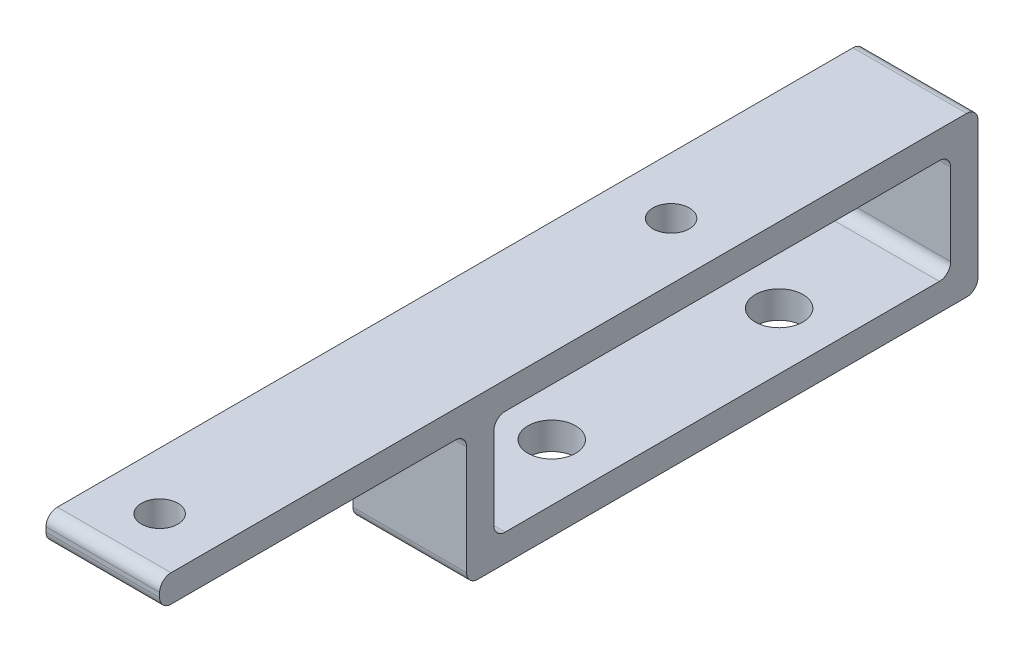
ISO-10303-21;
HEADER;
FILE_DESCRIPTION(('STEP AP214'),'2;1');
FILE_NAME('part.step','',(''),(''),'','','');
FILE_SCHEMA(('AUTOMOTIVE_DESIGN { 1 0 10303 214 1 1 1 1 }'));
ENDSEC;
DATA;
#1=APPLICATION_CONTEXT('core data for automotive mechanical design processes');
#2=APPLICATION_PROTOCOL_DEFINITION('international standard','automotive_design',2000,#1);
#3=PRODUCT_CONTEXT('',#1,'mechanical');
#4=PRODUCT('Part','Part','',(#3));
#5=PRODUCT_RELATED_PRODUCT_CATEGORY('part','',(#4));
#6=PRODUCT_DEFINITION_FORMATION('','',#4);
#7=PRODUCT_DEFINITION_CONTEXT('part definition',#1,'design');
#8=PRODUCT_DEFINITION('design','',#6,#7);
#9=PRODUCT_DEFINITION_SHAPE('','',#8);
#10=(LENGTH_UNIT() NAMED_UNIT(*) SI_UNIT(.MILLI.,.METRE.));
#11=(NAMED_UNIT(*) PLANE_ANGLE_UNIT() SI_UNIT($,.RADIAN.));
#12=(NAMED_UNIT(*) SI_UNIT($,.STERADIAN.) SOLID_ANGLE_UNIT());
#13=UNCERTAINTY_MEASURE_WITH_UNIT(LENGTH_MEASURE(1.E-05),#10,'distance_accuracy_value','');
#14=(GEOMETRIC_REPRESENTATION_CONTEXT(3) GLOBAL_UNCERTAINTY_ASSIGNED_CONTEXT((#13)) GLOBAL_UNIT_ASSIGNED_CONTEXT((#10,
#11,#12)) REPRESENTATION_CONTEXT('',''));
#15=CARTESIAN_POINT('',(0.,0.,0.));
#16=DIRECTION('',(0.,0.,1.));
#17=DIRECTION('',(1.,0.,0.));
#18=AXIS2_PLACEMENT_3D('',#15,#16,#17);
#19=CARTESIAN_POINT('',(10.,0.,-45.));
#20=DIRECTION('',(0.,1.,0.));
#21=DIRECTION('',(0.,0.,1.));
#22=AXIS2_PLACEMENT_3D('',#19,#20,#21);
#23=PLANE('',#22);
#24=CARTESIAN_POINT('',(5.,0.,-12.5));
#25=DIRECTION('',(0.,1.,0.));
#26=DIRECTION('',(0.,0.,1.));
#27=AXIS2_PLACEMENT_3D('',#24,#25,#26);
#28=CIRCLE('',#27,2.1);
#29=CARTESIAN_POINT('',(5.,0.,-10.4));
#30=VERTEX_POINT('',#29);
#31=EDGE_CURVE('E445',#30,#30,#28,.T.);
#32=ORIENTED_EDGE('',*,*,#31,.T.);
#33=EDGE_LOOP('',(#32));
#34=FACE_BOUND('',#33,.T.);
#35=CARTESIAN_POINT('',(5.,0.,-32.5));
#36=DIRECTION('',(0.,1.,0.));
#37=DIRECTION('',(0.,0.,1.));
#38=AXIS2_PLACEMENT_3D('',#35,#36,#37);
#39=CIRCLE('',#38,2.1);
#40=CARTESIAN_POINT('',(5.,0.,-30.4));
#41=VERTEX_POINT('',#40);
#42=EDGE_CURVE('E455',#41,#41,#39,.T.);
#43=ORIENTED_EDGE('',*,*,#42,.T.);
#44=EDGE_LOOP('',(#43));
#45=FACE_BOUND('',#44,.T.);
#46=DIRECTION('',(0.,0.,-1.));
#47=VECTOR('',#46,1.);
#48=CARTESIAN_POINT('',(0.,0.,-45.));
#49=LINE('',#48,#47);
#50=CARTESIAN_POINT('',(0.,0.,-1.00000000000001));
#51=VERTEX_POINT('',#50);
#52=CARTESIAN_POINT('',(0.,0.,-44.));
#53=VERTEX_POINT('',#52);
#54=EDGE_CURVE('E321',#51,#53,#49,.T.);
#55=ORIENTED_EDGE('',*,*,#54,.T.);
#56=DIRECTION('',(-1.,0.,0.));
#57=VECTOR('',#56,1.);
#58=CARTESIAN_POINT('',(10.,0.,-44.));
#59=LINE('',#58,#57);
#60=CARTESIAN_POINT('',(10.,0.,-44.));
#61=VERTEX_POINT('',#60);
#62=EDGE_CURVE('E184',#53,#61,#59,.F.);
#63=ORIENTED_EDGE('',*,*,#62,.T.);
#64=DIRECTION('',(0.,0.,-1.));
#65=VECTOR('',#64,1.);
#66=CARTESIAN_POINT('',(10.,0.,-45.));
#67=LINE('',#66,#65);
#68=CARTESIAN_POINT('',(10.,0.,-1.00000000000001));
#69=VERTEX_POINT('',#68);
#70=EDGE_CURVE('E201',#69,#61,#67,.T.);
#71=ORIENTED_EDGE('',*,*,#70,.F.);
#72=DIRECTION('',(-1.,0.,0.));
#73=VECTOR('',#72,1.);
#74=CARTESIAN_POINT('',(10.,0.,-1.));
#75=LINE('',#74,#73);
#76=EDGE_CURVE('E266',#69,#51,#75,.T.);
#77=ORIENTED_EDGE('',*,*,#76,.T.);
#78=EDGE_LOOP('',(#55,#63,#71,#77));
#79=FACE_BOUND('',#78,.T.);
#80=ADVANCED_FACE('F35',(#34,#45,#79),#23,.F.);
#81=CARTESIAN_POINT('',(10.,14.,-45.));
#82=DIRECTION('',(0.,0.,1.));
#83=DIRECTION('',(1.,0.,0.));
#84=AXIS2_PLACEMENT_3D('',#81,#82,#83);
#85=PLANE('',#84);
#86=DIRECTION('',(0.,1.,0.));
#87=VECTOR('',#86,1.);
#88=CARTESIAN_POINT('',(0.,14.,-45.));
#89=LINE('',#88,#87);
#90=CARTESIAN_POINT('',(0.,1.,-45.));
#91=VERTEX_POINT('',#90);
#92=CARTESIAN_POINT('',(0.,13.,-45.));
#93=VERTEX_POINT('',#92);
#94=EDGE_CURVE('E342',#91,#93,#89,.T.);
#95=ORIENTED_EDGE('',*,*,#94,.T.);
#96=DIRECTION('',(-1.,0.,0.));
#97=VECTOR('',#96,1.);
#98=CARTESIAN_POINT('',(10.,13.,-45.));
#99=LINE('',#98,#97);
#100=CARTESIAN_POINT('',(10.,13.,-45.));
#101=VERTEX_POINT('',#100);
#102=EDGE_CURVE('E50',#93,#101,#99,.F.);
#103=ORIENTED_EDGE('',*,*,#102,.T.);
#104=DIRECTION('',(0.,1.,0.));
#105=VECTOR('',#104,1.);
#106=CARTESIAN_POINT('',(10.,14.,-45.));
#107=LINE('',#106,#105);
#108=CARTESIAN_POINT('',(10.,1.,-45.));
#109=VERTEX_POINT('',#108);
#110=EDGE_CURVE('E204',#109,#101,#107,.T.);
#111=ORIENTED_EDGE('',*,*,#110,.F.);
#112=DIRECTION('',(-1.,0.,0.));
#113=VECTOR('',#112,1.);
#114=CARTESIAN_POINT('',(10.,1.,-45.));
#115=LINE('',#114,#113);
#116=EDGE_CURVE('E262',#109,#91,#115,.T.);
#117=ORIENTED_EDGE('',*,*,#116,.T.);
#118=EDGE_LOOP('',(#95,#103,#111,#117));
#119=FACE_BOUND('',#118,.T.);
#120=ADVANCED_FACE('F370',(#119),#85,.F.);
#121=CARTESIAN_POINT('',(10.,14.,0.));
#122=DIRECTION('',(0.,-1.,0.));
#123=DIRECTION('',(0.,0.,-1.));
#124=AXIS2_PLACEMENT_3D('',#121,#122,#123);
#125=PLANE('',#124);
#126=CARTESIAN_POINT('',(5.00000000000001,14.,22.));
#127=DIRECTION('',(0.,1.,0.));
#128=DIRECTION('',(0.,0.,1.));
#129=AXIS2_PLACEMENT_3D('',#126,#127,#128);
#130=CIRCLE('',#129,1.6);
#131=CARTESIAN_POINT('',(5.00000000000001,14.,23.6));
#132=VERTEX_POINT('',#131);
#133=EDGE_CURVE('E436',#132,#132,#130,.T.);
#134=ORIENTED_EDGE('',*,*,#133,.F.);
#135=EDGE_LOOP('',(#134));
#136=FACE_BOUND('',#135,.T.);
#137=CARTESIAN_POINT('',(4.99999999999999,14.,-23.));
#138=DIRECTION('',(0.,1.,0.));
#139=DIRECTION('',(0.,0.,1.));
#140=AXIS2_PLACEMENT_3D('',#137,#138,#139);
#141=CIRCLE('',#140,1.59999999999999);
#142=CARTESIAN_POINT('',(4.99999999999999,14.,-21.4));
#143=VERTEX_POINT('',#142);
#144=EDGE_CURVE('E439',#143,#143,#141,.T.);
#145=ORIENTED_EDGE('',*,*,#144,.F.);
#146=EDGE_LOOP('',(#145));
#147=FACE_BOUND('',#146,.T.);
#148=DIRECTION('',(0.,0.,1.));
#149=VECTOR('',#148,1.);
#150=CARTESIAN_POINT('',(0.,14.,0.));
#151=LINE('',#150,#149);
#152=CARTESIAN_POINT('',(0.,14.,-44.));
#153=VERTEX_POINT('',#152);
#154=CARTESIAN_POINT('',(0.,14.,26.));
#155=VERTEX_POINT('',#154);
#156=EDGE_CURVE('E344',#153,#155,#151,.T.);
#157=ORIENTED_EDGE('',*,*,#156,.T.);
#158=DIRECTION('',(-1.,0.,0.));
#159=VECTOR('',#158,1.);
#160=CARTESIAN_POINT('',(10.,14.,26.));
#161=LINE('',#160,#159);
#162=CARTESIAN_POINT('',(10.,14.,26.));
#163=VERTEX_POINT('',#162);
#164=EDGE_CURVE('E246',#155,#163,#161,.F.);
#165=ORIENTED_EDGE('',*,*,#164,.T.);
#166=DIRECTION('',(0.,0.,1.));
#167=VECTOR('',#166,1.);
#168=CARTESIAN_POINT('',(10.,14.,0.));
#169=LINE('',#168,#167);
#170=CARTESIAN_POINT('',(10.,14.,-44.));
#171=VERTEX_POINT('',#170);
#172=EDGE_CURVE('E330',#171,#163,#169,.T.);
#173=ORIENTED_EDGE('',*,*,#172,.F.);
#174=DIRECTION('',(-1.,0.,0.));
#175=VECTOR('',#174,1.);
#176=CARTESIAN_POINT('',(10.,14.,-44.));
#177=LINE('',#176,#175);
#178=EDGE_CURVE('E243',#171,#153,#177,.T.);
#179=ORIENTED_EDGE('',*,*,#178,.T.);
#180=EDGE_LOOP('',(#157,#165,#173,#179));
#181=FACE_BOUND('',#180,.T.);
#182=ADVANCED_FACE('F366',(#136,#147,#181),#125,.F.);
#183=CARTESIAN_POINT('',(10.,14.,27.));
#184=DIRECTION('',(0.,0.,-1.));
#185=DIRECTION('',(0.,1.,0.));
#186=AXIS2_PLACEMENT_3D('',#183,#184,#185);
#187=PLANE('',#186);
#188=DIRECTION('',(0.,-1.,0.));
#189=VECTOR('',#188,1.);
#190=CARTESIAN_POINT('',(10.,14.,27.));
#191=LINE('',#190,#189);
#192=CARTESIAN_POINT('',(10.,13.,27.));
#193=VERTEX_POINT('',#192);
#194=CARTESIAN_POINT('',(10.,12.6,27.));
#195=VERTEX_POINT('',#194);
#196=EDGE_CURVE('E333',#193,#195,#191,.T.);
#197=ORIENTED_EDGE('',*,*,#196,.F.);
#198=DIRECTION('',(-1.,0.,0.));
#199=VECTOR('',#198,1.);
#200=CARTESIAN_POINT('',(10.,13.,27.));
#201=LINE('',#200,#199);
#202=CARTESIAN_POINT('',(0.,13.,27.));
#203=VERTEX_POINT('',#202);
#204=EDGE_CURVE('E231',#193,#203,#201,.T.);
#205=ORIENTED_EDGE('',*,*,#204,.T.);
#206=DIRECTION('',(0.,-1.,0.));
#207=VECTOR('',#206,1.);
#208=CARTESIAN_POINT('',(0.,14.,27.));
#209=LINE('',#208,#207);
#210=CARTESIAN_POINT('',(0.,12.6,27.));
#211=VERTEX_POINT('',#210);
#212=EDGE_CURVE('E206',#203,#211,#209,.T.);
#213=ORIENTED_EDGE('',*,*,#212,.T.);
#214=DIRECTION('',(-1.,0.,0.));
#215=VECTOR('',#214,1.);
#216=CARTESIAN_POINT('',(10.,12.6,27.));
#217=LINE('',#216,#215);
#218=EDGE_CURVE('E229',#211,#195,#217,.F.);
#219=ORIENTED_EDGE('',*,*,#218,.T.);
#220=EDGE_LOOP('',(#197,#205,#213,#219));
#221=FACE_BOUND('',#220,.T.);
#222=ADVANCED_FACE('F350',(#221),#187,.F.);
#223=CARTESIAN_POINT('',(10.,11.6,27.));
#224=DIRECTION('',(0.,1.,0.));
#225=DIRECTION('',(0.,0.,1.));
#226=AXIS2_PLACEMENT_3D('',#223,#224,#225);
#227=PLANE('',#226);
#228=CARTESIAN_POINT('',(5.00000000000001,11.6,22.));
#229=DIRECTION('',(0.,1.,0.));
#230=DIRECTION('',(0.,0.,1.));
#231=AXIS2_PLACEMENT_3D('',#228,#229,#230);
#232=CIRCLE('',#231,1.6);
#233=CARTESIAN_POINT('',(5.00000000000001,11.6,23.6));
#234=VERTEX_POINT('',#233);
#235=EDGE_CURVE('E442',#234,#234,#232,.F.);
#236=ORIENTED_EDGE('',*,*,#235,.F.);
#237=EDGE_LOOP('',(#236));
#238=FACE_BOUND('',#237,.T.);
#239=DIRECTION('',(0.,0.,-1.));
#240=VECTOR('',#239,1.);
#241=CARTESIAN_POINT('',(0.,11.6,27.));
#242=LINE('',#241,#240);
#243=CARTESIAN_POINT('',(0.,11.6,26.));
#244=VERTEX_POINT('',#243);
#245=CARTESIAN_POINT('',(0.,11.6,1.));
#246=VERTEX_POINT('',#245);
#247=EDGE_CURVE('E202',#244,#246,#242,.T.);
#248=ORIENTED_EDGE('',*,*,#247,.T.);
#249=DIRECTION('',(-1.,0.,0.));
#250=VECTOR('',#249,1.);
#251=CARTESIAN_POINT('',(10.,11.6,1.));
#252=LINE('',#251,#250);
#253=CARTESIAN_POINT('',(10.,11.6,1.));
#254=VERTEX_POINT('',#253);
#255=EDGE_CURVE('E178',#246,#254,#252,.F.);
#256=ORIENTED_EDGE('',*,*,#255,.T.);
#257=DIRECTION('',(0.,0.,-1.));
#258=VECTOR('',#257,1.);
#259=CARTESIAN_POINT('',(10.,11.6,27.));
#260=LINE('',#259,#258);
#261=CARTESIAN_POINT('',(10.,11.6,26.));
#262=VERTEX_POINT('',#261);
#263=EDGE_CURVE('E336',#262,#254,#260,.T.);
#264=ORIENTED_EDGE('',*,*,#263,.F.);
#265=DIRECTION('',(-1.,0.,0.));
#266=VECTOR('',#265,1.);
#267=CARTESIAN_POINT('',(10.,11.6,26.));
#268=LINE('',#267,#266);
#269=EDGE_CURVE('E194',#262,#244,#268,.T.);
#270=ORIENTED_EDGE('',*,*,#269,.T.);
#271=EDGE_LOOP('',(#248,#256,#264,#270));
#272=FACE_BOUND('',#271,.T.);
#273=ADVANCED_FACE('F357',(#238,#272),#227,.F.);
#274=CARTESIAN_POINT('',(10.,11.6,0.));
#275=DIRECTION('',(0.,0.,-1.));
#276=DIRECTION('',(-1.,0.,0.));
#277=AXIS2_PLACEMENT_3D('',#274,#275,#276);
#278=PLANE('',#277);
#279=DIRECTION('',(0.,-1.,0.));
#280=VECTOR('',#279,1.);
#281=CARTESIAN_POINT('',(10.,11.6,0.));
#282=LINE('',#281,#280);
#283=CARTESIAN_POINT('',(10.,10.6,0.));
#284=VERTEX_POINT('',#283);
#285=CARTESIAN_POINT('',(10.,1.,0.));
#286=VERTEX_POINT('',#285);
#287=EDGE_CURVE('E193',#284,#286,#282,.T.);
#288=ORIENTED_EDGE('',*,*,#287,.F.);
#289=DIRECTION('',(-1.,0.,0.));
#290=VECTOR('',#289,1.);
#291=CARTESIAN_POINT('',(0.,10.6,0.));
#292=LINE('',#291,#290);
#293=CARTESIAN_POINT('',(0.,10.6,0.));
#294=VERTEX_POINT('',#293);
#295=EDGE_CURVE('E177',#284,#294,#292,.T.);
#296=ORIENTED_EDGE('',*,*,#295,.T.);
#297=DIRECTION('',(0.,-1.,0.));
#298=VECTOR('',#297,1.);
#299=CARTESIAN_POINT('',(0.,11.6,0.));
#300=LINE('',#299,#298);
#301=CARTESIAN_POINT('',(0.,1.,0.));
#302=VERTEX_POINT('',#301);
#303=EDGE_CURVE('E190',#294,#302,#300,.T.);
#304=ORIENTED_EDGE('',*,*,#303,.T.);
#305=DIRECTION('',(-1.,0.,0.));
#306=VECTOR('',#305,1.);
#307=CARTESIAN_POINT('',(10.,1.,0.));
#308=LINE('',#307,#306);
#309=EDGE_CURVE('E195',#302,#286,#308,.F.);
#310=ORIENTED_EDGE('',*,*,#309,.T.);
#311=EDGE_LOOP('',(#288,#296,#304,#310));
#312=FACE_BOUND('',#311,.T.);
#313=ADVANCED_FACE('F189',(#312),#278,.F.);
#314=CARTESIAN_POINT('',(10.,0.,0.));
#315=DIRECTION('',(1.,0.,0.));
#316=DIRECTION('',(0.,0.,-1.));
#317=AXIS2_PLACEMENT_3D('',#314,#315,#316);
#318=PLANE('',#317);
#319=DIRECTION('',(0.,-1.,0.));
#320=VECTOR('',#319,1.);
#321=CARTESIAN_POINT('',(10.,11.6,-2.4));
#322=LINE('',#321,#320);
#323=CARTESIAN_POINT('',(10.,10.6,-2.4));
#324=VERTEX_POINT('',#323);
#325=CARTESIAN_POINT('',(10.,3.4,-2.4));
#326=VERTEX_POINT('',#325);
#327=EDGE_CURVE('E287',#324,#326,#322,.T.);
#328=ORIENTED_EDGE('',*,*,#327,.F.);
#329=CARTESIAN_POINT('',(10.,10.6,-3.4));
#330=DIRECTION('',(1.,0.,0.));
#331=DIRECTION('',(0.,0.,-1.));
#332=AXIS2_PLACEMENT_3D('',#329,#330,#331);
#333=CIRCLE('',#332,1.);
#334=CARTESIAN_POINT('',(10.,11.6,-3.4));
#335=VERTEX_POINT('',#334);
#336=EDGE_CURVE('E279',#324,#335,#333,.F.);
#337=ORIENTED_EDGE('',*,*,#336,.T.);
#338=DIRECTION('',(0.,0.,1.));
#339=VECTOR('',#338,1.);
#340=CARTESIAN_POINT('',(10.,11.6,-2.4));
#341=LINE('',#340,#339);
#342=CARTESIAN_POINT('',(10.,11.6,-41.6));
#343=VERTEX_POINT('',#342);
#344=EDGE_CURVE('E316',#343,#335,#341,.T.);
#345=ORIENTED_EDGE('',*,*,#344,.F.);
#346=CARTESIAN_POINT('',(10.,10.6,-41.6));
#347=DIRECTION('',(1.,0.,0.));
#348=DIRECTION('',(0.,0.,-1.));
#349=AXIS2_PLACEMENT_3D('',#346,#347,#348);
#350=CIRCLE('',#349,1.);
#351=CARTESIAN_POINT('',(10.,10.6,-42.6));
#352=VERTEX_POINT('',#351);
#353=EDGE_CURVE('E271',#343,#352,#350,.F.);
#354=ORIENTED_EDGE('',*,*,#353,.T.);
#355=DIRECTION('',(0.,1.,0.));
#356=VECTOR('',#355,1.);
#357=CARTESIAN_POINT('',(10.,2.4,-42.6));
#358=LINE('',#357,#356);
#359=CARTESIAN_POINT('',(10.,3.4,-42.6));
#360=VERTEX_POINT('',#359);
#361=EDGE_CURVE('E324',#360,#352,#358,.T.);
#362=ORIENTED_EDGE('',*,*,#361,.F.);
#363=CARTESIAN_POINT('',(10.,3.4,-41.6));
#364=DIRECTION('',(1.,0.,0.));
#365=DIRECTION('',(0.,0.,-1.));
#366=AXIS2_PLACEMENT_3D('',#363,#364,#365);
#367=CIRCLE('',#366,1.);
#368=CARTESIAN_POINT('',(10.,2.4,-41.6));
#369=VERTEX_POINT('',#368);
#370=EDGE_CURVE('E275',#360,#369,#367,.F.);
#371=ORIENTED_EDGE('',*,*,#370,.T.);
#372=DIRECTION('',(0.,0.,-1.));
#373=VECTOR('',#372,1.);
#374=CARTESIAN_POINT('',(10.,2.4,-2.4));
#375=LINE('',#374,#373);
#376=CARTESIAN_POINT('',(10.,2.4,-3.4));
#377=VERTEX_POINT('',#376);
#378=EDGE_CURVE('E289',#377,#369,#375,.T.);
#379=ORIENTED_EDGE('',*,*,#378,.F.);
#380=CARTESIAN_POINT('',(10.,3.4,-3.4));
#381=DIRECTION('',(1.,0.,0.));
#382=DIRECTION('',(0.,0.,-1.));
#383=AXIS2_PLACEMENT_3D('',#380,#381,#382);
#384=CIRCLE('',#383,1.);
#385=EDGE_CURVE('E43',#377,#326,#384,.F.);
#386=ORIENTED_EDGE('',*,*,#385,.T.);
#387=EDGE_LOOP('',(#328,#337,#345,#354,#362,#371,#379,#386));
#388=FACE_BOUND('',#387,.T.);
#389=ORIENTED_EDGE('',*,*,#172,.T.);
#390=CARTESIAN_POINT('',(10.,13.,26.));
#391=DIRECTION('',(1.,0.,0.));
#392=DIRECTION('',(0.,0.,-1.));
#393=AXIS2_PLACEMENT_3D('',#390,#391,#392);
#394=CIRCLE('',#393,1.);
#395=EDGE_CURVE('E255',#163,#193,#394,.T.);
#396=ORIENTED_EDGE('',*,*,#395,.T.);
#397=ORIENTED_EDGE('',*,*,#196,.T.);
#398=CARTESIAN_POINT('',(10.,12.6,26.));
#399=DIRECTION('',(1.,0.,0.));
#400=DIRECTION('',(0.,0.,-1.));
#401=AXIS2_PLACEMENT_3D('',#398,#399,#400);
#402=CIRCLE('',#401,1.);
#403=EDGE_CURVE('E248',#195,#262,#402,.T.);
#404=ORIENTED_EDGE('',*,*,#403,.T.);
#405=ORIENTED_EDGE('',*,*,#263,.T.);
#406=CARTESIAN_POINT('',(10.,10.6,1.));
#407=DIRECTION('',(1.,0.,0.));
#408=DIRECTION('',(0.,0.,-1.));
#409=AXIS2_PLACEMENT_3D('',#406,#407,#408);
#410=CIRCLE('',#409,1.);
#411=EDGE_CURVE('E183',#254,#284,#410,.F.);
#412=ORIENTED_EDGE('',*,*,#411,.T.);
#413=ORIENTED_EDGE('',*,*,#287,.T.);
#414=CARTESIAN_POINT('',(10.,1.,-1.));
#415=DIRECTION('',(1.,0.,0.));
#416=DIRECTION('',(0.,0.,-1.));
#417=AXIS2_PLACEMENT_3D('',#414,#415,#416);
#418=CIRCLE('',#417,1.);
#419=EDGE_CURVE('E250',#286,#69,#418,.T.);
#420=ORIENTED_EDGE('',*,*,#419,.T.);
#421=ORIENTED_EDGE('',*,*,#70,.T.);
#422=CARTESIAN_POINT('',(10.,1.,-44.));
#423=DIRECTION('',(1.,0.,0.));
#424=DIRECTION('',(0.,0.,-1.));
#425=AXIS2_PLACEMENT_3D('',#422,#423,#424);
#426=CIRCLE('',#425,1.);
#427=EDGE_CURVE('E57',#61,#109,#426,.T.);
#428=ORIENTED_EDGE('',*,*,#427,.T.);
#429=ORIENTED_EDGE('',*,*,#110,.T.);
#430=CARTESIAN_POINT('',(10.,13.,-44.));
#431=DIRECTION('',(1.,0.,0.));
#432=DIRECTION('',(0.,0.,-1.));
#433=AXIS2_PLACEMENT_3D('',#430,#431,#432);
#434=CIRCLE('',#433,1.);
#435=EDGE_CURVE('E253',#101,#171,#434,.T.);
#436=ORIENTED_EDGE('',*,*,#435,.T.);
#437=EDGE_LOOP('',(#389,#396,#397,#404,#405,#412,#413,#420,#421,#428,#429,#436));
#438=FACE_BOUND('',#437,.T.);
#439=ADVANCED_FACE('F286',(#388,#438),#318,.T.);
#440=CARTESIAN_POINT('',(0.,0.,0.));
#441=DIRECTION('',(1.,0.,0.));
#442=DIRECTION('',(0.,0.,-1.));
#443=AXIS2_PLACEMENT_3D('',#440,#441,#442);
#444=PLANE('',#443);
#445=DIRECTION('',(0.,1.,0.));
#446=VECTOR('',#445,1.);
#447=CARTESIAN_POINT('',(0.,2.4,-42.6));
#448=LINE('',#447,#446);
#449=CARTESIAN_POINT('',(0.,3.4,-42.6));
#450=VERTEX_POINT('',#449);
#451=CARTESIAN_POINT('',(0.,10.6,-42.6));
#452=VERTEX_POINT('',#451);
#453=EDGE_CURVE('E312',#450,#452,#448,.T.);
#454=ORIENTED_EDGE('',*,*,#453,.T.);
#455=CARTESIAN_POINT('',(0.,10.6,-41.6));
#456=DIRECTION('',(1.,0.,0.));
#457=DIRECTION('',(0.,0.,-1.));
#458=AXIS2_PLACEMENT_3D('',#455,#456,#457);
#459=CIRCLE('',#458,1.);
#460=CARTESIAN_POINT('',(0.,11.6,-41.6));
#461=VERTEX_POINT('',#460);
#462=EDGE_CURVE('E273',#452,#461,#459,.T.);
#463=ORIENTED_EDGE('',*,*,#462,.T.);
#464=DIRECTION('',(0.,0.,1.));
#465=VECTOR('',#464,1.);
#466=CARTESIAN_POINT('',(0.,11.6,-2.4));
#467=LINE('',#466,#465);
#468=CARTESIAN_POINT('',(0.,11.6,-3.4));
#469=VERTEX_POINT('',#468);
#470=EDGE_CURVE('E314',#461,#469,#467,.T.);
#471=ORIENTED_EDGE('',*,*,#470,.T.);
#472=CARTESIAN_POINT('',(0.,10.6,-3.4));
#473=DIRECTION('',(1.,0.,0.));
#474=DIRECTION('',(0.,0.,-1.));
#475=AXIS2_PLACEMENT_3D('',#472,#473,#474);
#476=CIRCLE('',#475,1.);
#477=CARTESIAN_POINT('',(0.,10.6,-2.4));
#478=VERTEX_POINT('',#477);
#479=EDGE_CURVE('E281',#469,#478,#476,.T.);
#480=ORIENTED_EDGE('',*,*,#479,.T.);
#481=DIRECTION('',(0.,-1.,0.));
#482=VECTOR('',#481,1.);
#483=CARTESIAN_POINT('',(0.,11.6,-2.4));
#484=LINE('',#483,#482);
#485=CARTESIAN_POINT('',(0.,3.4,-2.4));
#486=VERTEX_POINT('',#485);
#487=EDGE_CURVE('E308',#478,#486,#484,.T.);
#488=ORIENTED_EDGE('',*,*,#487,.T.);
#489=CARTESIAN_POINT('',(0.,3.4,-3.4));
#490=DIRECTION('',(1.,0.,0.));
#491=DIRECTION('',(0.,0.,-1.));
#492=AXIS2_PLACEMENT_3D('',#489,#490,#491);
#493=CIRCLE('',#492,1.);
#494=CARTESIAN_POINT('',(0.,2.4,-3.4));
#495=VERTEX_POINT('',#494);
#496=EDGE_CURVE('E11',#486,#495,#493,.T.);
#497=ORIENTED_EDGE('',*,*,#496,.T.);
#498=DIRECTION('',(0.,0.,-1.));
#499=VECTOR('',#498,1.);
#500=CARTESIAN_POINT('',(0.,2.4,-2.4));
#501=LINE('',#500,#499);
#502=CARTESIAN_POINT('',(0.,2.4,-41.6));
#503=VERTEX_POINT('',#502);
#504=EDGE_CURVE('E306',#495,#503,#501,.T.);
#505=ORIENTED_EDGE('',*,*,#504,.T.);
#506=CARTESIAN_POINT('',(0.,3.4,-41.6));
#507=DIRECTION('',(1.,0.,0.));
#508=DIRECTION('',(0.,0.,-1.));
#509=AXIS2_PLACEMENT_3D('',#506,#507,#508);
#510=CIRCLE('',#509,1.);
#511=EDGE_CURVE('E277',#503,#450,#510,.T.);
#512=ORIENTED_EDGE('',*,*,#511,.T.);
#513=EDGE_LOOP('',(#454,#463,#471,#480,#488,#497,#505,#512));
#514=FACE_BOUND('',#513,.T.);
#515=ORIENTED_EDGE('',*,*,#212,.F.);
#516=CARTESIAN_POINT('',(0.,13.,26.));
#517=DIRECTION('',(1.,0.,0.));
#518=DIRECTION('',(0.,0.,-1.));
#519=AXIS2_PLACEMENT_3D('',#516,#517,#518);
#520=CIRCLE('',#519,1.);
#521=EDGE_CURVE('E241',#203,#155,#520,.F.);
#522=ORIENTED_EDGE('',*,*,#521,.T.);
#523=ORIENTED_EDGE('',*,*,#156,.F.);
#524=CARTESIAN_POINT('',(0.,13.,-44.));
#525=DIRECTION('',(1.,0.,0.));
#526=DIRECTION('',(0.,0.,-1.));
#527=AXIS2_PLACEMENT_3D('',#524,#525,#526);
#528=CIRCLE('',#527,1.);
#529=EDGE_CURVE('E239',#153,#93,#528,.F.);
#530=ORIENTED_EDGE('',*,*,#529,.T.);
#531=ORIENTED_EDGE('',*,*,#94,.F.);
#532=CARTESIAN_POINT('',(0.,1.,-44.));
#533=DIRECTION('',(1.,0.,0.));
#534=DIRECTION('',(0.,0.,-1.));
#535=AXIS2_PLACEMENT_3D('',#532,#533,#534);
#536=CIRCLE('',#535,1.);
#537=EDGE_CURVE('E237',#91,#53,#536,.F.);
#538=ORIENTED_EDGE('',*,*,#537,.T.);
#539=ORIENTED_EDGE('',*,*,#54,.F.);
#540=CARTESIAN_POINT('',(0.,1.,-1.));
#541=DIRECTION('',(1.,0.,0.));
#542=DIRECTION('',(0.,0.,-1.));
#543=AXIS2_PLACEMENT_3D('',#540,#541,#542);
#544=CIRCLE('',#543,1.);
#545=EDGE_CURVE('E200',#51,#302,#544,.F.);
#546=ORIENTED_EDGE('',*,*,#545,.T.);
#547=ORIENTED_EDGE('',*,*,#303,.F.);
#548=CARTESIAN_POINT('',(0.,10.6,1.));
#549=DIRECTION('',(1.,0.,0.));
#550=DIRECTION('',(0.,0.,-1.));
#551=AXIS2_PLACEMENT_3D('',#548,#549,#550);
#552=CIRCLE('',#551,1.);
#553=EDGE_CURVE('E173',#294,#246,#552,.T.);
#554=ORIENTED_EDGE('',*,*,#553,.T.);
#555=ORIENTED_EDGE('',*,*,#247,.F.);
#556=CARTESIAN_POINT('',(0.,12.6,26.));
#557=DIRECTION('',(1.,0.,0.));
#558=DIRECTION('',(0.,0.,-1.));
#559=AXIS2_PLACEMENT_3D('',#556,#557,#558);
#560=CIRCLE('',#559,1.);
#561=EDGE_CURVE('E234',#244,#211,#560,.F.);
#562=ORIENTED_EDGE('',*,*,#561,.T.);
#563=EDGE_LOOP('',(#515,#522,#523,#530,#531,#538,#539,#546,#547,#554,#555,#562));
#564=FACE_BOUND('',#563,.T.);
#565=ADVANCED_FACE('F198',(#514,#564),#444,.F.);
#566=CARTESIAN_POINT('',(0.,11.6,-2.4));
#567=DIRECTION('',(0.,0.,1.));
#568=DIRECTION('',(0.,-1.,0.));
#569=AXIS2_PLACEMENT_3D('',#566,#567,#568);
#570=PLANE('',#569);
#571=ORIENTED_EDGE('',*,*,#487,.F.);
#572=DIRECTION('',(1.,0.,0.));
#573=VECTOR('',#572,1.);
#574=CARTESIAN_POINT('',(10.,10.6,-2.4));
#575=LINE('',#574,#573);
#576=EDGE_CURVE('E259',#478,#324,#575,.T.);
#577=ORIENTED_EDGE('',*,*,#576,.T.);
#578=ORIENTED_EDGE('',*,*,#327,.T.);
#579=DIRECTION('',(1.,0.,0.));
#580=VECTOR('',#579,1.);
#581=CARTESIAN_POINT('',(0.,3.4,-2.4));
#582=LINE('',#581,#580);
#583=EDGE_CURVE('E257',#326,#486,#582,.F.);
#584=ORIENTED_EDGE('',*,*,#583,.T.);
#585=EDGE_LOOP('',(#571,#577,#578,#584));
#586=FACE_BOUND('',#585,.T.);
#587=ADVANCED_FACE('F295',(#586),#570,.F.);
#588=CARTESIAN_POINT('',(0.,11.6,-2.4));
#589=DIRECTION('',(0.,1.,0.));
#590=DIRECTION('',(0.,0.,1.));
#591=AXIS2_PLACEMENT_3D('',#588,#589,#590);
#592=PLANE('',#591);
#593=CARTESIAN_POINT('',(4.99999999999999,11.6,-23.));
#594=DIRECTION('',(0.,1.,0.));
#595=DIRECTION('',(0.,0.,1.));
#596=AXIS2_PLACEMENT_3D('',#593,#594,#595);
#597=CIRCLE('',#596,1.59999999999999);
#598=CARTESIAN_POINT('',(4.99999999999999,11.6,-21.4));
#599=VERTEX_POINT('',#598);
#600=EDGE_CURVE('E441',#599,#599,#597,.F.);
#601=ORIENTED_EDGE('',*,*,#600,.F.);
#602=EDGE_LOOP('',(#601));
#603=FACE_BOUND('',#602,.T.);
#604=ORIENTED_EDGE('',*,*,#470,.F.);
#605=DIRECTION('',(1.,0.,0.));
#606=VECTOR('',#605,1.);
#607=CARTESIAN_POINT('',(10.,11.6,-41.6));
#608=LINE('',#607,#606);
#609=EDGE_CURVE('E216',#461,#343,#608,.T.);
#610=ORIENTED_EDGE('',*,*,#609,.T.);
#611=ORIENTED_EDGE('',*,*,#344,.T.);
#612=DIRECTION('',(1.,0.,0.));
#613=VECTOR('',#612,1.);
#614=CARTESIAN_POINT('',(0.,11.6,-3.4));
#615=LINE('',#614,#613);
#616=EDGE_CURVE('E214',#335,#469,#615,.F.);
#617=ORIENTED_EDGE('',*,*,#616,.T.);
#618=EDGE_LOOP('',(#604,#610,#611,#617));
#619=FACE_BOUND('',#618,.T.);
#620=ADVANCED_FACE('F479',(#603,#619),#592,.F.);
#621=CARTESIAN_POINT('',(0.,2.4,-42.6));
#622=DIRECTION('',(0.,0.,-1.));
#623=DIRECTION('',(-1.,0.,0.));
#624=AXIS2_PLACEMENT_3D('',#621,#622,#623);
#625=PLANE('',#624);
#626=ORIENTED_EDGE('',*,*,#361,.T.);
#627=DIRECTION('',(1.,0.,0.));
#628=VECTOR('',#627,1.);
#629=CARTESIAN_POINT('',(0.,10.6,-42.6));
#630=LINE('',#629,#628);
#631=EDGE_CURVE('E222',#352,#452,#630,.F.);
#632=ORIENTED_EDGE('',*,*,#631,.T.);
#633=ORIENTED_EDGE('',*,*,#453,.F.);
#634=DIRECTION('',(1.,0.,0.));
#635=VECTOR('',#634,1.);
#636=CARTESIAN_POINT('',(10.,3.4,-42.6));
#637=LINE('',#636,#635);
#638=EDGE_CURVE('E219',#450,#360,#637,.T.);
#639=ORIENTED_EDGE('',*,*,#638,.T.);
#640=EDGE_LOOP('',(#626,#632,#633,#639));
#641=FACE_BOUND('',#640,.T.);
#642=ADVANCED_FACE('F474',(#641),#625,.F.);
#643=CARTESIAN_POINT('',(0.,2.4,-2.4));
#644=DIRECTION('',(0.,-1.,0.));
#645=DIRECTION('',(0.,0.,-1.));
#646=AXIS2_PLACEMENT_3D('',#643,#644,#645);
#647=PLANE('',#646);
#648=CARTESIAN_POINT('',(5.,2.4,-12.5));
#649=DIRECTION('',(0.,-1.,0.));
#650=DIRECTION('',(0.,0.,-1.));
#651=AXIS2_PLACEMENT_3D('',#648,#649,#650);
#652=CIRCLE('',#651,2.1);
#653=CARTESIAN_POINT('',(5.,2.4,-14.6));
#654=VERTEX_POINT('',#653);
#655=EDGE_CURVE('E452',#654,#654,#652,.T.);
#656=ORIENTED_EDGE('',*,*,#655,.T.);
#657=EDGE_LOOP('',(#656));
#658=FACE_BOUND('',#657,.T.);
#659=CARTESIAN_POINT('',(5.,2.4,-32.5));
#660=DIRECTION('',(0.,-1.,0.));
#661=DIRECTION('',(0.,0.,-1.));
#662=AXIS2_PLACEMENT_3D('',#659,#660,#661);
#663=CIRCLE('',#662,2.1);
#664=CARTESIAN_POINT('',(5.,2.4,-34.6));
#665=VERTEX_POINT('',#664);
#666=EDGE_CURVE('E298',#665,#665,#663,.T.);
#667=ORIENTED_EDGE('',*,*,#666,.T.);
#668=EDGE_LOOP('',(#667));
#669=FACE_BOUND('',#668,.T.);
#670=ORIENTED_EDGE('',*,*,#378,.T.);
#671=DIRECTION('',(1.,0.,0.));
#672=VECTOR('',#671,1.);
#673=CARTESIAN_POINT('',(0.,2.4,-41.6));
#674=LINE('',#673,#672);
#675=EDGE_CURVE('E227',#369,#503,#674,.F.);
#676=ORIENTED_EDGE('',*,*,#675,.T.);
#677=ORIENTED_EDGE('',*,*,#504,.F.);
#678=DIRECTION('',(1.,0.,0.));
#679=VECTOR('',#678,1.);
#680=CARTESIAN_POINT('',(10.,2.4,-3.4));
#681=LINE('',#680,#679);
#682=EDGE_CURVE('E224',#495,#377,#681,.T.);
#683=ORIENTED_EDGE('',*,*,#682,.T.);
#684=EDGE_LOOP('',(#670,#676,#677,#683));
#685=FACE_BOUND('',#684,.T.);
#686=ADVANCED_FACE('F310',(#658,#669,#685),#647,.F.);
#687=CARTESIAN_POINT('',(5.,8.33969696196699,-32.5));
#688=DIRECTION('',(0.,-1.,0.));
#689=DIRECTION('',(0.,0.,-1.));
#690=AXIS2_PLACEMENT_3D('',#687,#688,#689);
#691=CYLINDRICAL_SURFACE('',#690,2.1);
#692=ORIENTED_EDGE('',*,*,#666,.F.);
#693=EDGE_LOOP('',(#692));
#694=FACE_BOUND('',#693,.T.);
#695=ORIENTED_EDGE('',*,*,#42,.F.);
#696=EDGE_LOOP('',(#695));
#697=FACE_BOUND('',#696,.T.);
#698=ADVANCED_FACE('F461',(#694,#697),#691,.F.);
#699=CARTESIAN_POINT('',(5.,8.33969696196699,-12.5));
#700=DIRECTION('',(0.,-1.,0.));
#701=DIRECTION('',(0.,0.,-1.));
#702=AXIS2_PLACEMENT_3D('',#699,#700,#701);
#703=CYLINDRICAL_SURFACE('',#702,2.1);
#704=ORIENTED_EDGE('',*,*,#655,.F.);
#705=EDGE_LOOP('',(#704));
#706=FACE_BOUND('',#705,.T.);
#707=ORIENTED_EDGE('',*,*,#31,.F.);
#708=EDGE_LOOP('',(#707));
#709=FACE_BOUND('',#708,.T.);
#710=ADVANCED_FACE('F464',(#706,#709),#703,.F.);
#711=CARTESIAN_POINT('',(4.99999999999999,7.07451660040609,-23.));
#712=DIRECTION('',(0.,1.,0.));
#713=DIRECTION('',(0.,0.,1.));
#714=AXIS2_PLACEMENT_3D('',#711,#712,#713);
#715=CYLINDRICAL_SURFACE('',#714,1.59999999999999);
#716=ORIENTED_EDGE('',*,*,#600,.T.);
#717=EDGE_LOOP('',(#716));
#718=FACE_BOUND('',#717,.T.);
#719=ORIENTED_EDGE('',*,*,#144,.T.);
#720=EDGE_LOOP('',(#719));
#721=FACE_BOUND('',#720,.T.);
#722=ADVANCED_FACE('F471',(#718,#721),#715,.F.);
#723=CARTESIAN_POINT('',(5.00000000000001,7.07451660040609,22.));
#724=DIRECTION('',(0.,1.,0.));
#725=DIRECTION('',(0.,0.,1.));
#726=AXIS2_PLACEMENT_3D('',#723,#724,#725);
#727=CYLINDRICAL_SURFACE('',#726,1.6);
#728=ORIENTED_EDGE('',*,*,#235,.T.);
#729=EDGE_LOOP('',(#728));
#730=FACE_BOUND('',#729,.T.);
#731=ORIENTED_EDGE('',*,*,#133,.T.);
#732=EDGE_LOOP('',(#731));
#733=FACE_BOUND('',#732,.T.);
#734=ADVANCED_FACE('F384',(#730,#733),#727,.F.);
#735=CARTESIAN_POINT('',(10.,10.6,1.));
#736=DIRECTION('',(1.,0.,0.));
#737=DIRECTION('',(0.,0.,-1.));
#738=AXIS2_PLACEMENT_3D('',#735,#736,#737);
#739=CYLINDRICAL_SURFACE('',#738,1.);
#740=ORIENTED_EDGE('',*,*,#411,.F.);
#741=ORIENTED_EDGE('',*,*,#255,.F.);
#742=ORIENTED_EDGE('',*,*,#553,.F.);
#743=ORIENTED_EDGE('',*,*,#295,.F.);
#744=EDGE_LOOP('',(#740,#741,#742,#743));
#745=FACE_BOUND('',#744,.T.);
#746=ADVANCED_FACE('F176',(#745),#739,.F.);
#747=CARTESIAN_POINT('',(0.,10.6,-41.6));
#748=DIRECTION('',(-1.,0.,0.));
#749=DIRECTION('',(0.,0.,1.));
#750=AXIS2_PLACEMENT_3D('',#747,#748,#749);
#751=CYLINDRICAL_SURFACE('',#750,1.);
#752=ORIENTED_EDGE('',*,*,#462,.F.);
#753=ORIENTED_EDGE('',*,*,#631,.F.);
#754=ORIENTED_EDGE('',*,*,#353,.F.);
#755=ORIENTED_EDGE('',*,*,#609,.F.);
#756=EDGE_LOOP('',(#752,#753,#754,#755));
#757=FACE_BOUND('',#756,.T.);
#758=ADVANCED_FACE('F383',(#757),#751,.F.);
#759=CARTESIAN_POINT('',(0.,3.4,-41.6));
#760=DIRECTION('',(-1.,0.,0.));
#761=DIRECTION('',(0.,0.,1.));
#762=AXIS2_PLACEMENT_3D('',#759,#760,#761);
#763=CYLINDRICAL_SURFACE('',#762,1.);
#764=ORIENTED_EDGE('',*,*,#511,.F.);
#765=ORIENTED_EDGE('',*,*,#675,.F.);
#766=ORIENTED_EDGE('',*,*,#370,.F.);
#767=ORIENTED_EDGE('',*,*,#638,.F.);
#768=EDGE_LOOP('',(#764,#765,#766,#767));
#769=FACE_BOUND('',#768,.T.);
#770=ADVANCED_FACE('F387',(#769),#763,.F.);
#771=CARTESIAN_POINT('',(10.,13.,26.));
#772=DIRECTION('',(-1.,0.,0.));
#773=DIRECTION('',(0.,0.,1.));
#774=AXIS2_PLACEMENT_3D('',#771,#772,#773);
#775=CYLINDRICAL_SURFACE('',#774,1.);
#776=ORIENTED_EDGE('',*,*,#395,.F.);
#777=ORIENTED_EDGE('',*,*,#164,.F.);
#778=ORIENTED_EDGE('',*,*,#521,.F.);
#779=ORIENTED_EDGE('',*,*,#204,.F.);
#780=EDGE_LOOP('',(#776,#777,#778,#779));
#781=FACE_BOUND('',#780,.T.);
#782=ADVANCED_FACE('F391',(#781),#775,.T.);
#783=CARTESIAN_POINT('',(0.,10.6,-3.4));
#784=DIRECTION('',(-1.,0.,0.));
#785=DIRECTION('',(0.,0.,1.));
#786=AXIS2_PLACEMENT_3D('',#783,#784,#785);
#787=CYLINDRICAL_SURFACE('',#786,1.);
#788=ORIENTED_EDGE('',*,*,#479,.F.);
#789=ORIENTED_EDGE('',*,*,#616,.F.);
#790=ORIENTED_EDGE('',*,*,#336,.F.);
#791=ORIENTED_EDGE('',*,*,#576,.F.);
#792=EDGE_LOOP('',(#788,#789,#790,#791));
#793=FACE_BOUND('',#792,.T.);
#794=ADVANCED_FACE('F395',(#793),#787,.F.);
#795=CARTESIAN_POINT('',(0.,3.4,-3.4));
#796=DIRECTION('',(-1.,0.,0.));
#797=DIRECTION('',(0.,0.,1.));
#798=AXIS2_PLACEMENT_3D('',#795,#796,#797);
#799=CYLINDRICAL_SURFACE('',#798,1.);
#800=ORIENTED_EDGE('',*,*,#496,.F.);
#801=ORIENTED_EDGE('',*,*,#583,.F.);
#802=ORIENTED_EDGE('',*,*,#385,.F.);
#803=ORIENTED_EDGE('',*,*,#682,.F.);
#804=EDGE_LOOP('',(#800,#801,#802,#803));
#805=FACE_BOUND('',#804,.T.);
#806=ADVANCED_FACE('F301',(#805),#799,.F.);
#807=CARTESIAN_POINT('',(10.,13.,-44.));
#808=DIRECTION('',(-1.,0.,0.));
#809=DIRECTION('',(0.,0.,1.));
#810=AXIS2_PLACEMENT_3D('',#807,#808,#809);
#811=CYLINDRICAL_SURFACE('',#810,1.);
#812=ORIENTED_EDGE('',*,*,#435,.F.);
#813=ORIENTED_EDGE('',*,*,#102,.F.);
#814=ORIENTED_EDGE('',*,*,#529,.F.);
#815=ORIENTED_EDGE('',*,*,#178,.F.);
#816=EDGE_LOOP('',(#812,#813,#814,#815));
#817=FACE_BOUND('',#816,.T.);
#818=ADVANCED_FACE('F402',(#817),#811,.T.);
#819=CARTESIAN_POINT('',(10.,1.,-44.));
#820=DIRECTION('',(-1.,0.,0.));
#821=DIRECTION('',(0.,0.,1.));
#822=AXIS2_PLACEMENT_3D('',#819,#820,#821);
#823=CYLINDRICAL_SURFACE('',#822,1.);
#824=ORIENTED_EDGE('',*,*,#427,.F.);
#825=ORIENTED_EDGE('',*,*,#62,.F.);
#826=ORIENTED_EDGE('',*,*,#537,.F.);
#827=ORIENTED_EDGE('',*,*,#116,.F.);
#828=EDGE_LOOP('',(#824,#825,#826,#827));
#829=FACE_BOUND('',#828,.T.);
#830=ADVANCED_FACE('F405',(#829),#823,.T.);
#831=CARTESIAN_POINT('',(10.,1.,-1.));
#832=DIRECTION('',(-1.,0.,0.));
#833=DIRECTION('',(0.,0.,1.));
#834=AXIS2_PLACEMENT_3D('',#831,#832,#833);
#835=CYLINDRICAL_SURFACE('',#834,1.);
#836=ORIENTED_EDGE('',*,*,#419,.F.);
#837=ORIENTED_EDGE('',*,*,#309,.F.);
#838=ORIENTED_EDGE('',*,*,#545,.F.);
#839=ORIENTED_EDGE('',*,*,#76,.F.);
#840=EDGE_LOOP('',(#836,#837,#838,#839));
#841=FACE_BOUND('',#840,.T.);
#842=ADVANCED_FACE('F408',(#841),#835,.T.);
#843=CARTESIAN_POINT('',(10.,12.6,26.));
#844=DIRECTION('',(-1.,0.,0.));
#845=DIRECTION('',(0.,0.,1.));
#846=AXIS2_PLACEMENT_3D('',#843,#844,#845);
#847=CYLINDRICAL_SURFACE('',#846,1.);
#848=ORIENTED_EDGE('',*,*,#403,.F.);
#849=ORIENTED_EDGE('',*,*,#218,.F.);
#850=ORIENTED_EDGE('',*,*,#561,.F.);
#851=ORIENTED_EDGE('',*,*,#269,.F.);
#852=EDGE_LOOP('',(#848,#849,#850,#851));
#853=FACE_BOUND('',#852,.T.);
#854=ADVANCED_FACE('F37',(#853),#847,.T.);
#855=CLOSED_SHELL('',(#80,#120,#182,#222,#273,#313,#439,#565,#587,#620,#642,#686,#698,#710,#722,
#734,#746,#758,#770,#782,#794,#806,#818,#830,#842,#854));
#856=MANIFOLD_SOLID_BREP('B2',#855);
#857=ADVANCED_BREP_SHAPE_REPRESENTATION('',(#18,#856),#14);
#858=SHAPE_DEFINITION_REPRESENTATION(#9,#857);
ENDSEC;
END-ISO-10303-21;
